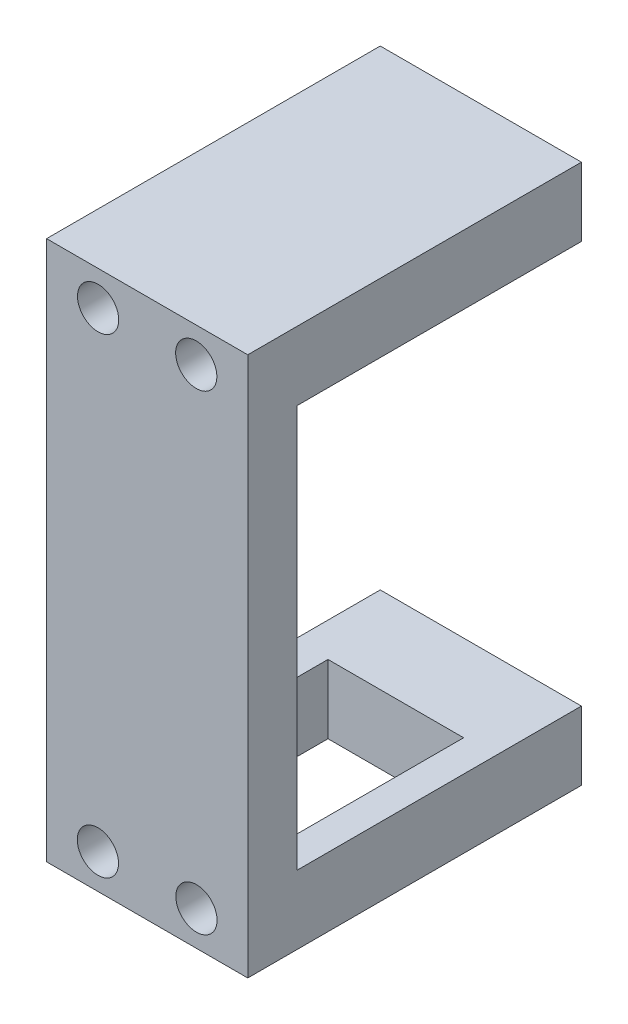
ISO-10303-21;
HEADER;
FILE_DESCRIPTION(('STEP AP214'),'2;1');
FILE_NAME('part.step','',(''),(''),'','','');
FILE_SCHEMA(('AUTOMOTIVE_DESIGN { 1 0 10303 214 1 1 1 1 }'));
ENDSEC;
DATA;
#1=APPLICATION_CONTEXT('core data for automotive mechanical design processes');
#2=APPLICATION_PROTOCOL_DEFINITION('international standard','automotive_design',2000,#1);
#3=PRODUCT_CONTEXT('',#1,'mechanical');
#4=PRODUCT('Part','Part','',(#3));
#5=PRODUCT_RELATED_PRODUCT_CATEGORY('part','',(#4));
#6=PRODUCT_DEFINITION_FORMATION('','',#4);
#7=PRODUCT_DEFINITION_CONTEXT('part definition',#1,'design');
#8=PRODUCT_DEFINITION('design','',#6,#7);
#9=PRODUCT_DEFINITION_SHAPE('','',#8);
#10=(LENGTH_UNIT() NAMED_UNIT(*) SI_UNIT(.MILLI.,.METRE.));
#11=(NAMED_UNIT(*) PLANE_ANGLE_UNIT() SI_UNIT($,.RADIAN.));
#12=(NAMED_UNIT(*) SI_UNIT($,.STERADIAN.) SOLID_ANGLE_UNIT());
#13=UNCERTAINTY_MEASURE_WITH_UNIT(LENGTH_MEASURE(1.E-05),#10,'distance_accuracy_value','');
#14=(GEOMETRIC_REPRESENTATION_CONTEXT(3) GLOBAL_UNCERTAINTY_ASSIGNED_CONTEXT((#13)) GLOBAL_UNIT_ASSIGNED_CONTEXT((#10,
#11,#12)) REPRESENTATION_CONTEXT('',''));
#15=CARTESIAN_POINT('',(0.,0.,0.));
#16=DIRECTION('',(0.,0.,1.));
#17=DIRECTION('',(1.,0.,0.));
#18=AXIS2_PLACEMENT_3D('',#15,#16,#17);
#19=CARTESIAN_POINT('',(20.5,-27.5,-31.5));
#20=DIRECTION('',(0.,0.,1.));
#21=DIRECTION('',(1.,0.,0.));
#22=AXIS2_PLACEMENT_3D('',#19,#20,#21);
#23=PLANE('',#22);
#24=CARTESIAN_POINT('',(5.22862141341502,-23.9703990760153,-31.5));
#25=DIRECTION('',(0.,0.,-1.));
#26=DIRECTION('',(1.,0.,0.));
#27=AXIS2_PLACEMENT_3D('',#24,#25,#26);
#28=CIRCLE('',#27,2.1);
#29=CARTESIAN_POINT('',(7.32862141341502,-23.9703990760153,-31.5));
#30=VERTEX_POINT('',#29);
#31=EDGE_CURVE('E265',#30,#30,#28,.T.);
#32=ORIENTED_EDGE('',*,*,#31,.F.);
#33=EDGE_LOOP('',(#32));
#34=FACE_BOUND('',#33,.T.);
#35=CARTESIAN_POINT('',(15.271378586585,-23.9703990760153,-31.5));
#36=DIRECTION('',(0.,0.,-1.));
#37=DIRECTION('',(-1.,0.,0.));
#38=AXIS2_PLACEMENT_3D('',#35,#36,#37);
#39=CIRCLE('',#38,2.1);
#40=CARTESIAN_POINT('',(13.171378586585,-23.9703990760153,-31.5));
#41=VERTEX_POINT('',#40);
#42=EDGE_CURVE('E268',#41,#41,#39,.T.);
#43=ORIENTED_EDGE('',*,*,#42,.F.);
#44=EDGE_LOOP('',(#43));
#45=FACE_BOUND('',#44,.T.);
#46=DIRECTION('',(0.,1.,0.));
#47=VECTOR('',#46,1.);
#48=CARTESIAN_POINT('',(0.,-27.5,-31.5));
#49=LINE('',#48,#47);
#50=CARTESIAN_POINT('',(0.,-27.5,-31.5));
#51=VERTEX_POINT('',#50);
#52=CARTESIAN_POINT('',(0.,-20.5,-31.5));
#53=VERTEX_POINT('',#52);
#54=EDGE_CURVE('E151',#51,#53,#49,.T.);
#55=ORIENTED_EDGE('',*,*,#54,.T.);
#56=DIRECTION('',(-1.,0.,0.));
#57=VECTOR('',#56,1.);
#58=CARTESIAN_POINT('',(20.5,-20.5,-31.5));
#59=LINE('',#58,#57);
#60=CARTESIAN_POINT('',(20.5,-20.5,-31.5));
#61=VERTEX_POINT('',#60);
#62=EDGE_CURVE('E40',#61,#53,#59,.T.);
#63=ORIENTED_EDGE('',*,*,#62,.F.);
#64=DIRECTION('',(0.,1.,0.));
#65=VECTOR('',#64,1.);
#66=CARTESIAN_POINT('',(20.5,-27.5,-31.5));
#67=LINE('',#66,#65);
#68=CARTESIAN_POINT('',(20.5,-27.5,-31.5));
#69=VERTEX_POINT('',#68);
#70=EDGE_CURVE('E156',#69,#61,#67,.T.);
#71=ORIENTED_EDGE('',*,*,#70,.F.);
#72=DIRECTION('',(-1.,0.,0.));
#73=VECTOR('',#72,1.);
#74=CARTESIAN_POINT('',(20.5,-27.5,-31.5));
#75=LINE('',#74,#73);
#76=EDGE_CURVE('E11',#69,#51,#75,.T.);
#77=ORIENTED_EDGE('',*,*,#76,.T.);
#78=EDGE_LOOP('',(#55,#63,#71,#77));
#79=FACE_BOUND('',#78,.T.);
#80=ADVANCED_FACE('F33',(#34,#45,#79),#23,.F.);
#81=CARTESIAN_POINT('',(20.5,-20.5,-2.5));
#82=DIRECTION('',(0.,-1.,0.));
#83=DIRECTION('',(0.,0.,-1.));
#84=AXIS2_PLACEMENT_3D('',#81,#82,#83);
#85=PLANE('',#84);
#86=DIRECTION('',(-1.,0.,0.));
#87=VECTOR('',#86,1.);
#88=CARTESIAN_POINT('',(3.47505882983183,-20.5,-22.7006961774004));
#89=LINE('',#88,#87);
#90=CARTESIAN_POINT('',(17.2959388169749,-20.5,-22.7006961774004));
#91=VERTEX_POINT('',#90);
#92=CARTESIAN_POINT('',(3.47505882983183,-20.5,-22.7006961774004));
#93=VERTEX_POINT('',#92);
#94=EDGE_CURVE('E280',#91,#93,#89,.T.);
#95=ORIENTED_EDGE('',*,*,#94,.F.);
#96=DIRECTION('',(0.,0.,-1.));
#97=VECTOR('',#96,1.);
#98=CARTESIAN_POINT('',(17.2959388169749,-20.5,-22.7006961774004));
#99=LINE('',#98,#97);
#100=CARTESIAN_POINT('',(17.2959388169749,-20.5,-3.12111619561435));
#101=VERTEX_POINT('',#100);
#102=EDGE_CURVE('E152',#101,#91,#99,.T.);
#103=ORIENTED_EDGE('',*,*,#102,.F.);
#104=DIRECTION('',(1.,0.,0.));
#105=VECTOR('',#104,1.);
#106=CARTESIAN_POINT('',(3.47505882983183,-20.5,-3.12111619561435));
#107=LINE('',#106,#105);
#108=CARTESIAN_POINT('',(3.47505882983183,-20.5,-3.12111619561435));
#109=VERTEX_POINT('',#108);
#110=EDGE_CURVE('E149',#109,#101,#107,.T.);
#111=ORIENTED_EDGE('',*,*,#110,.F.);
#112=DIRECTION('',(0.,0.,1.));
#113=VECTOR('',#112,1.);
#114=CARTESIAN_POINT('',(3.47505882983183,-20.5,-22.7006961774004));
#115=LINE('',#114,#113);
#116=EDGE_CURVE('E127',#93,#109,#115,.T.);
#117=ORIENTED_EDGE('',*,*,#116,.F.);
#118=EDGE_LOOP('',(#95,#103,#111,#117));
#119=FACE_BOUND('',#118,.T.);
#120=DIRECTION('',(0.,0.,1.));
#121=VECTOR('',#120,1.);
#122=CARTESIAN_POINT('',(0.,-20.5,-2.5));
#123=LINE('',#122,#121);
#124=CARTESIAN_POINT('',(0.,-20.5,-2.5));
#125=VERTEX_POINT('',#124);
#126=EDGE_CURVE('E174',#53,#125,#123,.T.);
#127=ORIENTED_EDGE('',*,*,#126,.T.);
#128=DIRECTION('',(-1.,0.,0.));
#129=VECTOR('',#128,1.);
#130=CARTESIAN_POINT('',(20.5,-20.5,-2.5));
#131=LINE('',#130,#129);
#132=CARTESIAN_POINT('',(20.5,-20.5,-2.5));
#133=VERTEX_POINT('',#132);
#134=EDGE_CURVE('E202',#133,#125,#131,.T.);
#135=ORIENTED_EDGE('',*,*,#134,.F.);
#136=DIRECTION('',(0.,0.,1.));
#137=VECTOR('',#136,1.);
#138=CARTESIAN_POINT('',(20.5,-20.5,-2.5));
#139=LINE('',#138,#137);
#140=EDGE_CURVE('E159',#61,#133,#139,.T.);
#141=ORIENTED_EDGE('',*,*,#140,.F.);
#142=ORIENTED_EDGE('',*,*,#62,.T.);
#143=EDGE_LOOP('',(#127,#135,#141,#142));
#144=FACE_BOUND('',#143,.T.);
#145=ADVANCED_FACE('F209',(#119,#144),#85,.F.);
#146=CARTESIAN_POINT('',(20.5,20.5,-2.5));
#147=DIRECTION('',(0.,0.,1.));
#148=DIRECTION('',(0.,-1.,0.));
#149=AXIS2_PLACEMENT_3D('',#146,#147,#148);
#150=PLANE('',#149);
#151=DIRECTION('',(0.,1.,0.));
#152=VECTOR('',#151,1.);
#153=CARTESIAN_POINT('',(0.,20.5,-2.5));
#154=LINE('',#153,#152);
#155=CARTESIAN_POINT('',(0.,20.5,-2.5));
#156=VERTEX_POINT('',#155);
#157=EDGE_CURVE('E176',#125,#156,#154,.T.);
#158=ORIENTED_EDGE('',*,*,#157,.T.);
#159=DIRECTION('',(-1.,0.,0.));
#160=VECTOR('',#159,1.);
#161=CARTESIAN_POINT('',(20.5,20.5,-2.5));
#162=LINE('',#161,#160);
#163=CARTESIAN_POINT('',(20.5,20.5,-2.5));
#164=VERTEX_POINT('',#163);
#165=EDGE_CURVE('E199',#164,#156,#162,.T.);
#166=ORIENTED_EDGE('',*,*,#165,.F.);
#167=DIRECTION('',(0.,1.,0.));
#168=VECTOR('',#167,1.);
#169=CARTESIAN_POINT('',(20.5,20.5,-2.5));
#170=LINE('',#169,#168);
#171=EDGE_CURVE('E161',#133,#164,#170,.T.);
#172=ORIENTED_EDGE('',*,*,#171,.F.);
#173=ORIENTED_EDGE('',*,*,#134,.T.);
#174=EDGE_LOOP('',(#158,#166,#172,#173));
#175=FACE_BOUND('',#174,.T.);
#176=ADVANCED_FACE('F221',(#175),#150,.F.);
#177=CARTESIAN_POINT('',(20.5,20.5,-2.5));
#178=DIRECTION('',(0.,1.,0.));
#179=DIRECTION('',(0.,0.,1.));
#180=AXIS2_PLACEMENT_3D('',#177,#178,#179);
#181=PLANE('',#180);
#182=DIRECTION('',(0.,0.,-1.));
#183=VECTOR('',#182,1.);
#184=CARTESIAN_POINT('',(0.,20.5,-2.5));
#185=LINE('',#184,#183);
#186=CARTESIAN_POINT('',(0.,20.5,-31.5));
#187=VERTEX_POINT('',#186);
#188=EDGE_CURVE('E178',#156,#187,#185,.T.);
#189=ORIENTED_EDGE('',*,*,#188,.T.);
#190=DIRECTION('',(-1.,0.,0.));
#191=VECTOR('',#190,1.);
#192=CARTESIAN_POINT('',(20.5,20.5,-31.5));
#193=LINE('',#192,#191);
#194=CARTESIAN_POINT('',(20.5,20.5,-31.5));
#195=VERTEX_POINT('',#194);
#196=EDGE_CURVE('E196',#195,#187,#193,.T.);
#197=ORIENTED_EDGE('',*,*,#196,.F.);
#198=DIRECTION('',(0.,0.,-1.));
#199=VECTOR('',#198,1.);
#200=CARTESIAN_POINT('',(20.5,20.5,-2.5));
#201=LINE('',#200,#199);
#202=EDGE_CURVE('E163',#164,#195,#201,.T.);
#203=ORIENTED_EDGE('',*,*,#202,.F.);
#204=ORIENTED_EDGE('',*,*,#165,.T.);
#205=EDGE_LOOP('',(#189,#197,#203,#204));
#206=FACE_BOUND('',#205,.T.);
#207=ADVANCED_FACE('F225',(#206),#181,.F.);
#208=CARTESIAN_POINT('',(20.5,27.5,-31.5));
#209=DIRECTION('',(0.,0.,1.));
#210=DIRECTION('',(1.,0.,0.));
#211=AXIS2_PLACEMENT_3D('',#208,#209,#210);
#212=PLANE('',#211);
#213=CARTESIAN_POINT('',(15.25,24.,-31.5));
#214=DIRECTION('',(0.,0.,-1.));
#215=DIRECTION('',(1.,0.,0.));
#216=AXIS2_PLACEMENT_3D('',#213,#214,#215);
#217=CIRCLE('',#216,2.1);
#218=CARTESIAN_POINT('',(17.35,24.,-31.5));
#219=VERTEX_POINT('',#218);
#220=EDGE_CURVE('E335',#219,#219,#217,.T.);
#221=ORIENTED_EDGE('',*,*,#220,.F.);
#222=EDGE_LOOP('',(#221));
#223=FACE_BOUND('',#222,.T.);
#224=CARTESIAN_POINT('',(5.25000000000002,24.,-31.5));
#225=DIRECTION('',(0.,0.,-1.));
#226=DIRECTION('',(-1.,0.,0.));
#227=AXIS2_PLACEMENT_3D('',#224,#225,#226);
#228=CIRCLE('',#227,2.1);
#229=CARTESIAN_POINT('',(3.15000000000001,24.,-31.5));
#230=VERTEX_POINT('',#229);
#231=EDGE_CURVE('E345',#230,#230,#228,.T.);
#232=ORIENTED_EDGE('',*,*,#231,.F.);
#233=EDGE_LOOP('',(#232));
#234=FACE_BOUND('',#233,.T.);
#235=DIRECTION('',(0.,1.,0.));
#236=VECTOR('',#235,1.);
#237=CARTESIAN_POINT('',(0.,27.5,-31.5));
#238=LINE('',#237,#236);
#239=CARTESIAN_POINT('',(0.,27.5,-31.5));
#240=VERTEX_POINT('',#239);
#241=EDGE_CURVE('E180',#187,#240,#238,.T.);
#242=ORIENTED_EDGE('',*,*,#241,.T.);
#243=DIRECTION('',(-1.,0.,0.));
#244=VECTOR('',#243,1.);
#245=CARTESIAN_POINT('',(20.5,27.5,-31.5));
#246=LINE('',#245,#244);
#247=CARTESIAN_POINT('',(20.5,27.5,-31.5));
#248=VERTEX_POINT('',#247);
#249=EDGE_CURVE('E193',#248,#240,#246,.T.);
#250=ORIENTED_EDGE('',*,*,#249,.F.);
#251=DIRECTION('',(0.,1.,0.));
#252=VECTOR('',#251,1.);
#253=CARTESIAN_POINT('',(20.5,27.5,-31.5));
#254=LINE('',#253,#252);
#255=EDGE_CURVE('E165',#195,#248,#254,.T.);
#256=ORIENTED_EDGE('',*,*,#255,.F.);
#257=ORIENTED_EDGE('',*,*,#196,.T.);
#258=EDGE_LOOP('',(#242,#250,#256,#257));
#259=FACE_BOUND('',#258,.T.);
#260=ADVANCED_FACE('F242',(#223,#234,#259),#212,.F.);
#261=CARTESIAN_POINT('',(20.5,27.5,2.5));
#262=DIRECTION('',(0.,-1.,0.));
#263=DIRECTION('',(0.,0.,-1.));
#264=AXIS2_PLACEMENT_3D('',#261,#262,#263);
#265=PLANE('',#264);
#266=DIRECTION('',(0.,0.,1.));
#267=VECTOR('',#266,1.);
#268=CARTESIAN_POINT('',(0.,27.5,2.5));
#269=LINE('',#268,#267);
#270=CARTESIAN_POINT('',(0.,27.5,2.5));
#271=VERTEX_POINT('',#270);
#272=EDGE_CURVE('E183',#240,#271,#269,.T.);
#273=ORIENTED_EDGE('',*,*,#272,.T.);
#274=DIRECTION('',(-1.,0.,0.));
#275=VECTOR('',#274,1.);
#276=CARTESIAN_POINT('',(20.5,27.5,2.5));
#277=LINE('',#276,#275);
#278=CARTESIAN_POINT('',(20.5,27.5,2.5));
#279=VERTEX_POINT('',#278);
#280=EDGE_CURVE('E190',#279,#271,#277,.T.);
#281=ORIENTED_EDGE('',*,*,#280,.F.);
#282=DIRECTION('',(0.,0.,1.));
#283=VECTOR('',#282,1.);
#284=CARTESIAN_POINT('',(20.5,27.5,-2.5));
#285=LINE('',#284,#283);
#286=EDGE_CURVE('E167',#248,#279,#285,.T.);
#287=ORIENTED_EDGE('',*,*,#286,.F.);
#288=ORIENTED_EDGE('',*,*,#249,.T.);
#289=EDGE_LOOP('',(#273,#281,#287,#288));
#290=FACE_BOUND('',#289,.T.);
#291=ADVANCED_FACE('F240',(#290),#265,.F.);
#292=CARTESIAN_POINT('',(20.5,27.5,2.5));
#293=DIRECTION('',(0.,0.,-1.));
#294=DIRECTION('',(0.,1.,0.));
#295=AXIS2_PLACEMENT_3D('',#292,#293,#294);
#296=PLANE('',#295);
#297=CARTESIAN_POINT('',(15.25,24.,2.50000000000001));
#298=DIRECTION('',(0.,0.,-1.));
#299=DIRECTION('',(1.,0.,0.));
#300=AXIS2_PLACEMENT_3D('',#297,#298,#299);
#301=CIRCLE('',#300,2.1);
#302=CARTESIAN_POINT('',(17.35,24.,2.50000000000001));
#303=VERTEX_POINT('',#302);
#304=EDGE_CURVE('E318',#303,#303,#301,.T.);
#305=ORIENTED_EDGE('',*,*,#304,.T.);
#306=EDGE_LOOP('',(#305));
#307=FACE_BOUND('',#306,.T.);
#308=CARTESIAN_POINT('',(5.25000000000002,24.,2.50000000000001));
#309=DIRECTION('',(0.,0.,-1.));
#310=DIRECTION('',(-1.,0.,0.));
#311=AXIS2_PLACEMENT_3D('',#308,#309,#310);
#312=CIRCLE('',#311,2.1);
#313=CARTESIAN_POINT('',(3.15000000000001,24.,2.50000000000001));
#314=VERTEX_POINT('',#313);
#315=EDGE_CURVE('E322',#314,#314,#312,.T.);
#316=ORIENTED_EDGE('',*,*,#315,.T.);
#317=EDGE_LOOP('',(#316));
#318=FACE_BOUND('',#317,.T.);
#319=CARTESIAN_POINT('',(5.22862141341502,-23.9703990760153,2.50000000000001));
#320=DIRECTION('',(0.,0.,-1.));
#321=DIRECTION('',(1.,0.,0.));
#322=AXIS2_PLACEMENT_3D('',#319,#320,#321);
#323=CIRCLE('',#322,2.1);
#324=CARTESIAN_POINT('',(7.32862141341502,-23.9703990760153,2.50000000000001));
#325=VERTEX_POINT('',#324);
#326=EDGE_CURVE('E326',#325,#325,#323,.T.);
#327=ORIENTED_EDGE('',*,*,#326,.T.);
#328=EDGE_LOOP('',(#327));
#329=FACE_BOUND('',#328,.T.);
#330=CARTESIAN_POINT('',(15.271378586585,-23.9703990760153,2.50000000000001));
#331=DIRECTION('',(0.,0.,-1.));
#332=DIRECTION('',(-1.,0.,0.));
#333=AXIS2_PLACEMENT_3D('',#330,#331,#332);
#334=CIRCLE('',#333,2.1);
#335=CARTESIAN_POINT('',(13.171378586585,-23.9703990760153,2.50000000000001));
#336=VERTEX_POINT('',#335);
#337=EDGE_CURVE('E329',#336,#336,#334,.T.);
#338=ORIENTED_EDGE('',*,*,#337,.T.);
#339=EDGE_LOOP('',(#338));
#340=FACE_BOUND('',#339,.T.);
#341=DIRECTION('',(0.,-1.,0.));
#342=VECTOR('',#341,1.);
#343=CARTESIAN_POINT('',(0.,27.5,2.5));
#344=LINE('',#343,#342);
#345=CARTESIAN_POINT('',(0.,-27.5,2.5));
#346=VERTEX_POINT('',#345);
#347=EDGE_CURVE('E185',#271,#346,#344,.T.);
#348=ORIENTED_EDGE('',*,*,#347,.T.);
#349=DIRECTION('',(-1.,0.,0.));
#350=VECTOR('',#349,1.);
#351=CARTESIAN_POINT('',(20.5,-27.5,2.5));
#352=LINE('',#351,#350);
#353=CARTESIAN_POINT('',(20.5,-27.5,2.5));
#354=VERTEX_POINT('',#353);
#355=EDGE_CURVE('E172',#354,#346,#352,.T.);
#356=ORIENTED_EDGE('',*,*,#355,.F.);
#357=DIRECTION('',(0.,-1.,0.));
#358=VECTOR('',#357,1.);
#359=CARTESIAN_POINT('',(20.5,27.5,2.5));
#360=LINE('',#359,#358);
#361=EDGE_CURVE('E169',#279,#354,#360,.T.);
#362=ORIENTED_EDGE('',*,*,#361,.F.);
#363=ORIENTED_EDGE('',*,*,#280,.T.);
#364=EDGE_LOOP('',(#348,#356,#362,#363));
#365=FACE_BOUND('',#364,.T.);
#366=ADVANCED_FACE('F235',(#307,#318,#329,#340,#365),#296,.F.);
#367=CARTESIAN_POINT('',(20.5,-27.5,2.5));
#368=DIRECTION('',(0.,1.,0.));
#369=DIRECTION('',(0.,0.,1.));
#370=AXIS2_PLACEMENT_3D('',#367,#368,#369);
#371=PLANE('',#370);
#372=DIRECTION('',(-1.,0.,0.));
#373=VECTOR('',#372,1.);
#374=CARTESIAN_POINT('',(3.47505882983183,-27.5,-3.12111619561435));
#375=LINE('',#374,#373);
#376=CARTESIAN_POINT('',(17.2959388169749,-27.5,-3.12111619561435));
#377=VERTEX_POINT('',#376);
#378=CARTESIAN_POINT('',(3.47505882983183,-27.5,-3.12111619561435));
#379=VERTEX_POINT('',#378);
#380=EDGE_CURVE('E133',#377,#379,#375,.T.);
#381=ORIENTED_EDGE('',*,*,#380,.F.);
#382=DIRECTION('',(0.,0.,1.));
#383=VECTOR('',#382,1.);
#384=CARTESIAN_POINT('',(17.2959388169749,-27.5,-22.7006961774004));
#385=LINE('',#384,#383);
#386=CARTESIAN_POINT('',(17.2959388169749,-27.5,-22.7006961774004));
#387=VERTEX_POINT('',#386);
#388=EDGE_CURVE('E55',#387,#377,#385,.T.);
#389=ORIENTED_EDGE('',*,*,#388,.F.);
#390=DIRECTION('',(1.,0.,0.));
#391=VECTOR('',#390,1.);
#392=CARTESIAN_POINT('',(3.47505882983183,-27.5,-22.7006961774004));
#393=LINE('',#392,#391);
#394=CARTESIAN_POINT('',(3.47505882983183,-27.5,-22.7006961774004));
#395=VERTEX_POINT('',#394);
#396=EDGE_CURVE('E140',#395,#387,#393,.T.);
#397=ORIENTED_EDGE('',*,*,#396,.F.);
#398=DIRECTION('',(0.,0.,-1.));
#399=VECTOR('',#398,1.);
#400=CARTESIAN_POINT('',(3.47505882983183,-27.5,-22.7006961774004));
#401=LINE('',#400,#399);
#402=EDGE_CURVE('E124',#379,#395,#401,.T.);
#403=ORIENTED_EDGE('',*,*,#402,.F.);
#404=EDGE_LOOP('',(#381,#389,#397,#403));
#405=FACE_BOUND('',#404,.T.);
#406=DIRECTION('',(0.,0.,-1.));
#407=VECTOR('',#406,1.);
#408=CARTESIAN_POINT('',(0.,-27.5,2.5));
#409=LINE('',#408,#407);
#410=EDGE_CURVE('E157',#346,#51,#409,.T.);
#411=ORIENTED_EDGE('',*,*,#410,.T.);
#412=ORIENTED_EDGE('',*,*,#76,.F.);
#413=DIRECTION('',(0.,0.,-1.));
#414=VECTOR('',#413,1.);
#415=CARTESIAN_POINT('',(20.5,-27.5,-2.5));
#416=LINE('',#415,#414);
#417=EDGE_CURVE('E153',#354,#69,#416,.T.);
#418=ORIENTED_EDGE('',*,*,#417,.F.);
#419=ORIENTED_EDGE('',*,*,#355,.T.);
#420=EDGE_LOOP('',(#411,#412,#418,#419));
#421=FACE_BOUND('',#420,.T.);
#422=ADVANCED_FACE('F137',(#405,#421),#371,.F.);
#423=CARTESIAN_POINT('',(20.5,0.,0.));
#424=DIRECTION('',(1.,0.,0.));
#425=DIRECTION('',(0.,0.,-1.));
#426=AXIS2_PLACEMENT_3D('',#423,#424,#425);
#427=PLANE('',#426);
#428=ORIENTED_EDGE('',*,*,#417,.T.);
#429=ORIENTED_EDGE('',*,*,#70,.T.);
#430=ORIENTED_EDGE('',*,*,#140,.T.);
#431=ORIENTED_EDGE('',*,*,#171,.T.);
#432=ORIENTED_EDGE('',*,*,#202,.T.);
#433=ORIENTED_EDGE('',*,*,#255,.T.);
#434=ORIENTED_EDGE('',*,*,#286,.T.);
#435=ORIENTED_EDGE('',*,*,#361,.T.);
#436=EDGE_LOOP('',(#428,#429,#430,#431,#432,#433,#434,#435));
#437=FACE_BOUND('',#436,.T.);
#438=ADVANCED_FACE('F229',(#437),#427,.T.);
#439=CARTESIAN_POINT('',(0.,0.,0.));
#440=DIRECTION('',(1.,0.,0.));
#441=DIRECTION('',(0.,0.,-1.));
#442=AXIS2_PLACEMENT_3D('',#439,#440,#441);
#443=PLANE('',#442);
#444=ORIENTED_EDGE('',*,*,#54,.F.);
#445=ORIENTED_EDGE('',*,*,#410,.F.);
#446=ORIENTED_EDGE('',*,*,#347,.F.);
#447=ORIENTED_EDGE('',*,*,#272,.F.);
#448=ORIENTED_EDGE('',*,*,#241,.F.);
#449=ORIENTED_EDGE('',*,*,#188,.F.);
#450=ORIENTED_EDGE('',*,*,#157,.F.);
#451=ORIENTED_EDGE('',*,*,#126,.F.);
#452=EDGE_LOOP('',(#444,#445,#446,#447,#448,#449,#450,#451));
#453=FACE_BOUND('',#452,.T.);
#454=ADVANCED_FACE('F215',(#453),#443,.F.);
#455=CARTESIAN_POINT('',(17.2959388169749,3.46615688595417,-22.7006961774004));
#456=DIRECTION('',(1.,0.,0.));
#457=DIRECTION('',(0.,0.,-1.));
#458=AXIS2_PLACEMENT_3D('',#455,#456,#457);
#459=PLANE('',#458);
#460=ORIENTED_EDGE('',*,*,#102,.T.);
#461=DIRECTION('',(0.,-1.,0.));
#462=VECTOR('',#461,1.);
#463=CARTESIAN_POINT('',(17.2959388169749,3.46615688595417,-22.7006961774004));
#464=LINE('',#463,#462);
#465=EDGE_CURVE('E145',#91,#387,#464,.T.);
#466=ORIENTED_EDGE('',*,*,#465,.T.);
#467=ORIENTED_EDGE('',*,*,#388,.T.);
#468=DIRECTION('',(0.,-1.,0.));
#469=VECTOR('',#468,1.);
#470=CARTESIAN_POINT('',(17.2959388169749,3.46615688595417,-3.12111619561435));
#471=LINE('',#470,#469);
#472=EDGE_CURVE('E130',#101,#377,#471,.T.);
#473=ORIENTED_EDGE('',*,*,#472,.F.);
#474=EDGE_LOOP('',(#460,#466,#467,#473));
#475=FACE_BOUND('',#474,.T.);
#476=ADVANCED_FACE('F284',(#475),#459,.F.);
#477=CARTESIAN_POINT('',(3.47505882983183,3.46615688595417,-22.7006961774004));
#478=DIRECTION('',(0.,0.,-1.));
#479=DIRECTION('',(-1.,0.,0.));
#480=AXIS2_PLACEMENT_3D('',#477,#478,#479);
#481=PLANE('',#480);
#482=ORIENTED_EDGE('',*,*,#94,.T.);
#483=DIRECTION('',(0.,-1.,0.));
#484=VECTOR('',#483,1.);
#485=CARTESIAN_POINT('',(3.47505882983183,3.46615688595417,-22.7006961774004));
#486=LINE('',#485,#484);
#487=EDGE_CURVE('E129',#93,#395,#486,.T.);
#488=ORIENTED_EDGE('',*,*,#487,.T.);
#489=ORIENTED_EDGE('',*,*,#396,.T.);
#490=ORIENTED_EDGE('',*,*,#465,.F.);
#491=EDGE_LOOP('',(#482,#488,#489,#490));
#492=FACE_BOUND('',#491,.T.);
#493=ADVANCED_FACE('F287',(#492),#481,.F.);
#494=CARTESIAN_POINT('',(3.47505882983183,3.46615688595417,-22.7006961774004));
#495=DIRECTION('',(-1.,0.,0.));
#496=DIRECTION('',(0.,0.,1.));
#497=AXIS2_PLACEMENT_3D('',#494,#495,#496);
#498=PLANE('',#497);
#499=ORIENTED_EDGE('',*,*,#116,.T.);
#500=DIRECTION('',(0.,-1.,0.));
#501=VECTOR('',#500,1.);
#502=CARTESIAN_POINT('',(3.47505882983183,3.46615688595417,-3.12111619561435));
#503=LINE('',#502,#501);
#504=EDGE_CURVE('E47',#109,#379,#503,.T.);
#505=ORIENTED_EDGE('',*,*,#504,.T.);
#506=ORIENTED_EDGE('',*,*,#402,.T.);
#507=ORIENTED_EDGE('',*,*,#487,.F.);
#508=EDGE_LOOP('',(#499,#505,#506,#507));
#509=FACE_BOUND('',#508,.T.);
#510=ADVANCED_FACE('F121',(#509),#498,.F.);
#511=CARTESIAN_POINT('',(3.47505882983183,3.46615688595417,-3.12111619561435));
#512=DIRECTION('',(0.,0.,1.));
#513=DIRECTION('',(1.,0.,0.));
#514=AXIS2_PLACEMENT_3D('',#511,#512,#513);
#515=PLANE('',#514);
#516=ORIENTED_EDGE('',*,*,#110,.T.);
#517=ORIENTED_EDGE('',*,*,#472,.T.);
#518=ORIENTED_EDGE('',*,*,#380,.T.);
#519=ORIENTED_EDGE('',*,*,#504,.F.);
#520=EDGE_LOOP('',(#516,#517,#518,#519));
#521=FACE_BOUND('',#520,.T.);
#522=ADVANCED_FACE('F134',(#521),#515,.F.);
#523=CARTESIAN_POINT('',(5.25000000000002,24.,-26.5));
#524=DIRECTION('',(0.,0.,-1.));
#525=DIRECTION('',(-1.,0.,0.));
#526=AXIS2_PLACEMENT_3D('',#523,#524,#525);
#527=CYLINDRICAL_SURFACE('',#526,2.1);
#528=CARTESIAN_POINT('',(5.25000000000002,24.,-26.5));
#529=DIRECTION('',(0.,0.,-1.));
#530=DIRECTION('',(-1.,0.,0.));
#531=AXIS2_PLACEMENT_3D('',#528,#529,#530);
#532=CIRCLE('',#531,2.1);
#533=CARTESIAN_POINT('',(3.15000000000001,24.,-26.5));
#534=VERTEX_POINT('',#533);
#535=EDGE_CURVE('E342',#534,#534,#532,.T.);
#536=ORIENTED_EDGE('',*,*,#535,.F.);
#537=EDGE_LOOP('',(#536));
#538=FACE_BOUND('',#537,.T.);
#539=ORIENTED_EDGE('',*,*,#231,.T.);
#540=EDGE_LOOP('',(#539));
#541=FACE_BOUND('',#540,.T.);
#542=ADVANCED_FACE('F301',(#538,#541),#527,.F.);
#543=CARTESIAN_POINT('',(5.25000000000002,24.,-26.5));
#544=DIRECTION('',(0.,0.,-1.));
#545=DIRECTION('',(-1.,0.,0.));
#546=AXIS2_PLACEMENT_3D('',#543,#544,#545);
#547=PLANE('',#546);
#548=ORIENTED_EDGE('',*,*,#535,.T.);
#549=EDGE_LOOP('',(#548));
#550=FACE_BOUND('',#549,.T.);
#551=ADVANCED_FACE('F355',(#550),#547,.T.);
#552=CARTESIAN_POINT('',(15.25,24.,-26.5));
#553=DIRECTION('',(0.,0.,-1.));
#554=DIRECTION('',(-1.,0.,0.));
#555=AXIS2_PLACEMENT_3D('',#552,#553,#554);
#556=CYLINDRICAL_SURFACE('',#555,2.1);
#557=CARTESIAN_POINT('',(15.25,24.,-26.5));
#558=DIRECTION('',(0.,0.,-1.));
#559=DIRECTION('',(1.,0.,0.));
#560=AXIS2_PLACEMENT_3D('',#557,#558,#559);
#561=CIRCLE('',#560,2.1);
#562=CARTESIAN_POINT('',(17.35,24.,-26.5));
#563=VERTEX_POINT('',#562);
#564=EDGE_CURVE('E348',#563,#563,#561,.T.);
#565=ORIENTED_EDGE('',*,*,#564,.F.);
#566=EDGE_LOOP('',(#565));
#567=FACE_BOUND('',#566,.T.);
#568=ORIENTED_EDGE('',*,*,#220,.T.);
#569=EDGE_LOOP('',(#568));
#570=FACE_BOUND('',#569,.T.);
#571=ADVANCED_FACE('F352',(#567,#570),#556,.F.);
#572=CARTESIAN_POINT('',(15.25,24.,-26.5));
#573=DIRECTION('',(0.,0.,1.));
#574=DIRECTION('',(1.,0.,0.));
#575=AXIS2_PLACEMENT_3D('',#572,#573,#574);
#576=PLANE('',#575);
#577=ORIENTED_EDGE('',*,*,#564,.T.);
#578=EDGE_LOOP('',(#577));
#579=FACE_BOUND('',#578,.T.);
#580=ADVANCED_FACE('F354',(#579),#576,.F.);
#581=CARTESIAN_POINT('',(15.271378586585,-23.9703990760153,-26.5));
#582=DIRECTION('',(0.,0.,-1.));
#583=DIRECTION('',(-1.,0.,0.));
#584=AXIS2_PLACEMENT_3D('',#581,#582,#583);
#585=CYLINDRICAL_SURFACE('',#584,2.1);
#586=CARTESIAN_POINT('',(15.271378586585,-23.9703990760153,-26.5));
#587=DIRECTION('',(0.,0.,-1.));
#588=DIRECTION('',(-1.,0.,0.));
#589=AXIS2_PLACEMENT_3D('',#586,#587,#588);
#590=CIRCLE('',#589,2.1);
#591=CARTESIAN_POINT('',(13.171378586585,-23.9703990760153,-26.5));
#592=VERTEX_POINT('',#591);
#593=EDGE_CURVE('E270',#592,#592,#590,.T.);
#594=ORIENTED_EDGE('',*,*,#593,.F.);
#595=EDGE_LOOP('',(#594));
#596=FACE_BOUND('',#595,.T.);
#597=ORIENTED_EDGE('',*,*,#42,.T.);
#598=EDGE_LOOP('',(#597));
#599=FACE_BOUND('',#598,.T.);
#600=ADVANCED_FACE('F297',(#596,#599),#585,.F.);
#601=CARTESIAN_POINT('',(15.271378586585,-23.9703990760153,-26.5));
#602=DIRECTION('',(0.,0.,-1.));
#603=DIRECTION('',(-1.,0.,0.));
#604=AXIS2_PLACEMENT_3D('',#601,#602,#603);
#605=PLANE('',#604);
#606=ORIENTED_EDGE('',*,*,#593,.T.);
#607=EDGE_LOOP('',(#606));
#608=FACE_BOUND('',#607,.T.);
#609=ADVANCED_FACE('F368',(#608),#605,.T.);
#610=CARTESIAN_POINT('',(5.22862141341502,-23.9703990760153,-26.5));
#611=DIRECTION('',(0.,0.,-1.));
#612=DIRECTION('',(-1.,0.,0.));
#613=AXIS2_PLACEMENT_3D('',#610,#611,#612);
#614=CYLINDRICAL_SURFACE('',#613,2.1);
#615=CARTESIAN_POINT('',(5.22862141341502,-23.9703990760153,-26.5));
#616=DIRECTION('',(0.,0.,-1.));
#617=DIRECTION('',(1.,0.,0.));
#618=AXIS2_PLACEMENT_3D('',#615,#616,#617);
#619=CIRCLE('',#618,2.1);
#620=CARTESIAN_POINT('',(7.32862141341502,-23.9703990760153,-26.5));
#621=VERTEX_POINT('',#620);
#622=EDGE_CURVE('E271',#621,#621,#619,.T.);
#623=ORIENTED_EDGE('',*,*,#622,.F.);
#624=EDGE_LOOP('',(#623));
#625=FACE_BOUND('',#624,.T.);
#626=ORIENTED_EDGE('',*,*,#31,.T.);
#627=EDGE_LOOP('',(#626));
#628=FACE_BOUND('',#627,.T.);
#629=ADVANCED_FACE('F370',(#625,#628),#614,.F.);
#630=CARTESIAN_POINT('',(5.22862141341502,-23.9703990760153,-26.5));
#631=DIRECTION('',(0.,0.,1.));
#632=DIRECTION('',(1.,0.,0.));
#633=AXIS2_PLACEMENT_3D('',#630,#631,#632);
#634=PLANE('',#633);
#635=ORIENTED_EDGE('',*,*,#622,.T.);
#636=EDGE_LOOP('',(#635));
#637=FACE_BOUND('',#636,.T.);
#638=ADVANCED_FACE('F376',(#637),#634,.F.);
#639=CARTESIAN_POINT('',(15.271378586585,-23.9703990760153,-2.49999999999999));
#640=DIRECTION('',(0.,0.,1.));
#641=DIRECTION('',(1.,0.,0.));
#642=AXIS2_PLACEMENT_3D('',#639,#640,#641);
#643=CYLINDRICAL_SURFACE('',#642,2.1);
#644=CARTESIAN_POINT('',(15.271378586585,-23.9703990760153,-2.49999999999999));
#645=DIRECTION('',(0.,0.,-1.));
#646=DIRECTION('',(-1.,0.,0.));
#647=AXIS2_PLACEMENT_3D('',#644,#645,#646);
#648=CIRCLE('',#647,2.1);
#649=CARTESIAN_POINT('',(13.171378586585,-23.9703990760153,-2.49999999999999));
#650=VERTEX_POINT('',#649);
#651=EDGE_CURVE('E331',#650,#650,#648,.T.);
#652=ORIENTED_EDGE('',*,*,#651,.T.);
#653=EDGE_LOOP('',(#652));
#654=FACE_BOUND('',#653,.T.);
#655=ORIENTED_EDGE('',*,*,#337,.F.);
#656=EDGE_LOOP('',(#655));
#657=FACE_BOUND('',#656,.T.);
#658=ADVANCED_FACE('F496',(#654,#657),#643,.F.);
#659=CARTESIAN_POINT('',(15.271378586585,-23.9703990760153,-2.49999999999999));
#660=DIRECTION('',(0.,0.,1.));
#661=DIRECTION('',(-1.,0.,0.));
#662=AXIS2_PLACEMENT_3D('',#659,#660,#661);
#663=PLANE('',#662);
#664=ORIENTED_EDGE('',*,*,#651,.F.);
#665=EDGE_LOOP('',(#664));
#666=FACE_BOUND('',#665,.T.);
#667=ADVANCED_FACE('F500',(#666),#663,.T.);
#668=CARTESIAN_POINT('',(5.22862141341502,-23.9703990760153,-2.49999999999999));
#669=DIRECTION('',(0.,0.,1.));
#670=DIRECTION('',(1.,0.,0.));
#671=AXIS2_PLACEMENT_3D('',#668,#669,#670);
#672=CYLINDRICAL_SURFACE('',#671,2.1);
#673=CARTESIAN_POINT('',(5.22862141341502,-23.9703990760153,-2.49999999999999));
#674=DIRECTION('',(0.,0.,-1.));
#675=DIRECTION('',(1.,0.,0.));
#676=AXIS2_PLACEMENT_3D('',#673,#674,#675);
#677=CIRCLE('',#676,2.1);
#678=CARTESIAN_POINT('',(7.32862141341502,-23.9703990760153,-2.49999999999999));
#679=VERTEX_POINT('',#678);
#680=EDGE_CURVE('E332',#679,#679,#677,.T.);
#681=ORIENTED_EDGE('',*,*,#680,.T.);
#682=EDGE_LOOP('',(#681));
#683=FACE_BOUND('',#682,.T.);
#684=ORIENTED_EDGE('',*,*,#326,.F.);
#685=EDGE_LOOP('',(#684));
#686=FACE_BOUND('',#685,.T.);
#687=ADVANCED_FACE('F504',(#683,#686),#672,.F.);
#688=CARTESIAN_POINT('',(5.22862141341502,-23.9703990760153,-2.49999999999999));
#689=DIRECTION('',(0.,0.,-1.));
#690=DIRECTION('',(1.,0.,0.));
#691=AXIS2_PLACEMENT_3D('',#688,#689,#690);
#692=PLANE('',#691);
#693=ORIENTED_EDGE('',*,*,#680,.F.);
#694=EDGE_LOOP('',(#693));
#695=FACE_BOUND('',#694,.T.);
#696=ADVANCED_FACE('F518',(#695),#692,.F.);
#697=CARTESIAN_POINT('',(5.25000000000002,24.,-2.49999999999999));
#698=DIRECTION('',(0.,0.,1.));
#699=DIRECTION('',(1.,0.,0.));
#700=AXIS2_PLACEMENT_3D('',#697,#698,#699);
#701=CYLINDRICAL_SURFACE('',#700,2.1);
#702=CARTESIAN_POINT('',(5.25000000000002,24.,-2.49999999999999));
#703=DIRECTION('',(0.,0.,-1.));
#704=DIRECTION('',(-1.,0.,0.));
#705=AXIS2_PLACEMENT_3D('',#702,#703,#704);
#706=CIRCLE('',#705,2.1);
#707=CARTESIAN_POINT('',(3.15000000000001,24.,-2.49999999999999));
#708=VERTEX_POINT('',#707);
#709=EDGE_CURVE('E532',#708,#708,#706,.T.);
#710=ORIENTED_EDGE('',*,*,#709,.T.);
#711=EDGE_LOOP('',(#710));
#712=FACE_BOUND('',#711,.T.);
#713=ORIENTED_EDGE('',*,*,#315,.F.);
#714=EDGE_LOOP('',(#713));
#715=FACE_BOUND('',#714,.T.);
#716=ADVANCED_FACE('F515',(#712,#715),#701,.F.);
#717=CARTESIAN_POINT('',(5.25000000000002,24.,-2.49999999999999));
#718=DIRECTION('',(0.,0.,1.));
#719=DIRECTION('',(-1.,0.,0.));
#720=AXIS2_PLACEMENT_3D('',#717,#718,#719);
#721=PLANE('',#720);
#722=ORIENTED_EDGE('',*,*,#709,.F.);
#723=EDGE_LOOP('',(#722));
#724=FACE_BOUND('',#723,.T.);
#725=ADVANCED_FACE('F510',(#724),#721,.T.);
#726=CARTESIAN_POINT('',(15.25,24.,-2.49999999999999));
#727=DIRECTION('',(0.,0.,1.));
#728=DIRECTION('',(1.,0.,0.));
#729=AXIS2_PLACEMENT_3D('',#726,#727,#728);
#730=CYLINDRICAL_SURFACE('',#729,2.1);
#731=CARTESIAN_POINT('',(15.25,24.,-2.49999999999999));
#732=DIRECTION('',(0.,0.,-1.));
#733=DIRECTION('',(1.,0.,0.));
#734=AXIS2_PLACEMENT_3D('',#731,#732,#733);
#735=CIRCLE('',#734,2.1);
#736=CARTESIAN_POINT('',(17.35,24.,-2.49999999999999));
#737=VERTEX_POINT('',#736);
#738=EDGE_CURVE('E538',#737,#737,#735,.T.);
#739=ORIENTED_EDGE('',*,*,#738,.T.);
#740=EDGE_LOOP('',(#739));
#741=FACE_BOUND('',#740,.T.);
#742=ORIENTED_EDGE('',*,*,#304,.F.);
#743=EDGE_LOOP('',(#742));
#744=FACE_BOUND('',#743,.T.);
#745=ADVANCED_FACE('F506',(#741,#744),#730,.F.);
#746=CARTESIAN_POINT('',(15.25,24.,-2.49999999999999));
#747=DIRECTION('',(0.,0.,-1.));
#748=DIRECTION('',(1.,0.,0.));
#749=AXIS2_PLACEMENT_3D('',#746,#747,#748);
#750=PLANE('',#749);
#751=ORIENTED_EDGE('',*,*,#738,.F.);
#752=EDGE_LOOP('',(#751));
#753=FACE_BOUND('',#752,.T.);
#754=ADVANCED_FACE('F509',(#753),#750,.F.);
#755=CLOSED_SHELL('',(#80,#145,#176,#207,#260,#291,#366,#422,#438,#454,#476,#493,#510,#522,#542,
#551,#571,#580,#600,#609,#629,#638,#658,#667,#687,#696,#716,#725,#745,#754));
#756=MANIFOLD_SOLID_BREP('B2',#755);
#757=ADVANCED_BREP_SHAPE_REPRESENTATION('',(#18,#756),#14);
#758=SHAPE_DEFINITION_REPRESENTATION(#9,#757);
ENDSEC;
END-ISO-10303-21;
